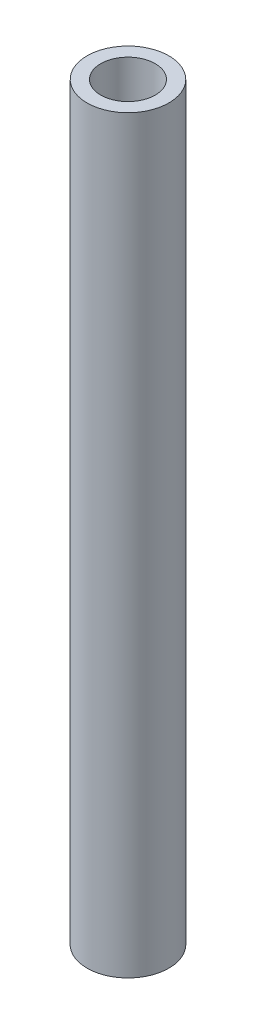
ISO-10303-21;
HEADER;
FILE_DESCRIPTION(('STEP AP214'),'2;1');
FILE_NAME('part.step','',(''),(''),'','','');
FILE_SCHEMA(('AUTOMOTIVE_DESIGN { 1 0 10303 214 1 1 1 1 }'));
ENDSEC;
DATA;
#1=APPLICATION_CONTEXT('core data for automotive mechanical design processes');
#2=APPLICATION_PROTOCOL_DEFINITION('international standard','automotive_design',2000,#1);
#3=PRODUCT_CONTEXT('',#1,'mechanical');
#4=PRODUCT('Part','Part','',(#3));
#5=PRODUCT_RELATED_PRODUCT_CATEGORY('part','',(#4));
#6=PRODUCT_DEFINITION_FORMATION('','',#4);
#7=PRODUCT_DEFINITION_CONTEXT('part definition',#1,'design');
#8=PRODUCT_DEFINITION('design','',#6,#7);
#9=PRODUCT_DEFINITION_SHAPE('','',#8);
#10=(LENGTH_UNIT() NAMED_UNIT(*) SI_UNIT(.MILLI.,.METRE.));
#11=(NAMED_UNIT(*) PLANE_ANGLE_UNIT() SI_UNIT($,.RADIAN.));
#12=(NAMED_UNIT(*) SI_UNIT($,.STERADIAN.) SOLID_ANGLE_UNIT());
#13=UNCERTAINTY_MEASURE_WITH_UNIT(LENGTH_MEASURE(1.E-05),#10,'distance_accuracy_value','');
#14=(GEOMETRIC_REPRESENTATION_CONTEXT(3) GLOBAL_UNCERTAINTY_ASSIGNED_CONTEXT((#13)) GLOBAL_UNIT_ASSIGNED_CONTEXT((#10,
#11,#12)) REPRESENTATION_CONTEXT('',''));
#15=CARTESIAN_POINT('',(0.,0.,0.));
#16=DIRECTION('',(0.,0.,1.));
#17=DIRECTION('',(1.,0.,0.));
#18=AXIS2_PLACEMENT_3D('',#15,#16,#17);
#19=CARTESIAN_POINT('',(0.,55.,0.));
#20=DIRECTION('',(0.,-1.,0.));
#21=DIRECTION('',(0.,0.,-1.));
#22=AXIS2_PLACEMENT_3D('',#19,#20,#21);
#23=CYLINDRICAL_SURFACE('',#22,3.);
#24=CARTESIAN_POINT('',(0.,55.,0.));
#25=DIRECTION('',(0.,1.,0.));
#26=DIRECTION('',(0.,0.,1.));
#27=AXIS2_PLACEMENT_3D('',#24,#25,#26);
#28=CIRCLE('',#27,3.);
#29=CARTESIAN_POINT('',(0.,55.,3.));
#30=VERTEX_POINT('',#29);
#31=EDGE_CURVE('E10',#30,#30,#28,.T.);
#32=ORIENTED_EDGE('',*,*,#31,.F.);
#33=EDGE_LOOP('',(#32));
#34=FACE_BOUND('',#33,.T.);
#35=CARTESIAN_POINT('',(0.,0.,0.));
#36=DIRECTION('',(0.,1.,0.));
#37=DIRECTION('',(0.,0.,1.));
#38=AXIS2_PLACEMENT_3D('',#35,#36,#37);
#39=CIRCLE('',#38,3.);
#40=CARTESIAN_POINT('',(0.,0.,3.));
#41=VERTEX_POINT('',#40);
#42=EDGE_CURVE('E40',#41,#41,#39,.T.);
#43=ORIENTED_EDGE('',*,*,#42,.T.);
#44=EDGE_LOOP('',(#43));
#45=FACE_BOUND('',#44,.T.);
#46=ADVANCED_FACE('F37',(#34,#45),#23,.T.);
#47=CARTESIAN_POINT('',(0.,55.,0.));
#48=DIRECTION('',(0.,1.,0.));
#49=DIRECTION('',(0.,0.,1.));
#50=AXIS2_PLACEMENT_3D('',#47,#48,#49);
#51=PLANE('',#50);
#52=CARTESIAN_POINT('',(0.,55.,0.));
#53=DIRECTION('',(0.,1.,0.));
#54=DIRECTION('',(0.,0.,1.));
#55=AXIS2_PLACEMENT_3D('',#52,#53,#54);
#56=CIRCLE('',#55,2.);
#57=CARTESIAN_POINT('',(0.,55.,2.));
#58=VERTEX_POINT('',#57);
#59=EDGE_CURVE('E51',#58,#58,#56,.T.);
#60=ORIENTED_EDGE('',*,*,#59,.F.);
#61=EDGE_LOOP('',(#60));
#62=FACE_BOUND('',#61,.T.);
#63=ORIENTED_EDGE('',*,*,#31,.T.);
#64=EDGE_LOOP('',(#63));
#65=FACE_BOUND('',#64,.T.);
#66=ADVANCED_FACE('F68',(#62,#65),#51,.T.);
#67=CARTESIAN_POINT('',(0.,0.,0.));
#68=DIRECTION('',(0.,1.,0.));
#69=DIRECTION('',(0.,0.,1.));
#70=AXIS2_PLACEMENT_3D('',#67,#68,#69);
#71=PLANE('',#70);
#72=CARTESIAN_POINT('',(0.,0.,0.));
#73=DIRECTION('',(0.,1.,0.));
#74=DIRECTION('',(0.,0.,1.));
#75=AXIS2_PLACEMENT_3D('',#72,#73,#74);
#76=CIRCLE('',#75,2.);
#77=CARTESIAN_POINT('',(0.,0.,2.));
#78=VERTEX_POINT('',#77);
#79=EDGE_CURVE('E49',#78,#78,#76,.T.);
#80=ORIENTED_EDGE('',*,*,#79,.T.);
#81=EDGE_LOOP('',(#80));
#82=FACE_BOUND('',#81,.T.);
#83=ORIENTED_EDGE('',*,*,#42,.F.);
#84=EDGE_LOOP('',(#83));
#85=FACE_BOUND('',#84,.T.);
#86=ADVANCED_FACE('F59',(#82,#85),#71,.F.);
#87=CARTESIAN_POINT('',(0.,0.,0.));
#88=DIRECTION('',(0.,1.,0.));
#89=DIRECTION('',(0.,0.,1.));
#90=AXIS2_PLACEMENT_3D('',#87,#88,#89);
#91=CYLINDRICAL_SURFACE('',#90,2.);
#92=ORIENTED_EDGE('',*,*,#79,.F.);
#93=EDGE_LOOP('',(#92));
#94=FACE_BOUND('',#93,.T.);
#95=ORIENTED_EDGE('',*,*,#59,.T.);
#96=EDGE_LOOP('',(#95));
#97=FACE_BOUND('',#96,.T.);
#98=ADVANCED_FACE('F62',(#94,#97),#91,.F.);
#99=CLOSED_SHELL('',(#46,#66,#86,#98));
#100=MANIFOLD_SOLID_BREP('B2',#99);
#101=ADVANCED_BREP_SHAPE_REPRESENTATION('',(#18,#100),#14);
#102=SHAPE_DEFINITION_REPRESENTATION(#9,#101);
ENDSEC;
END-ISO-10303-21;
